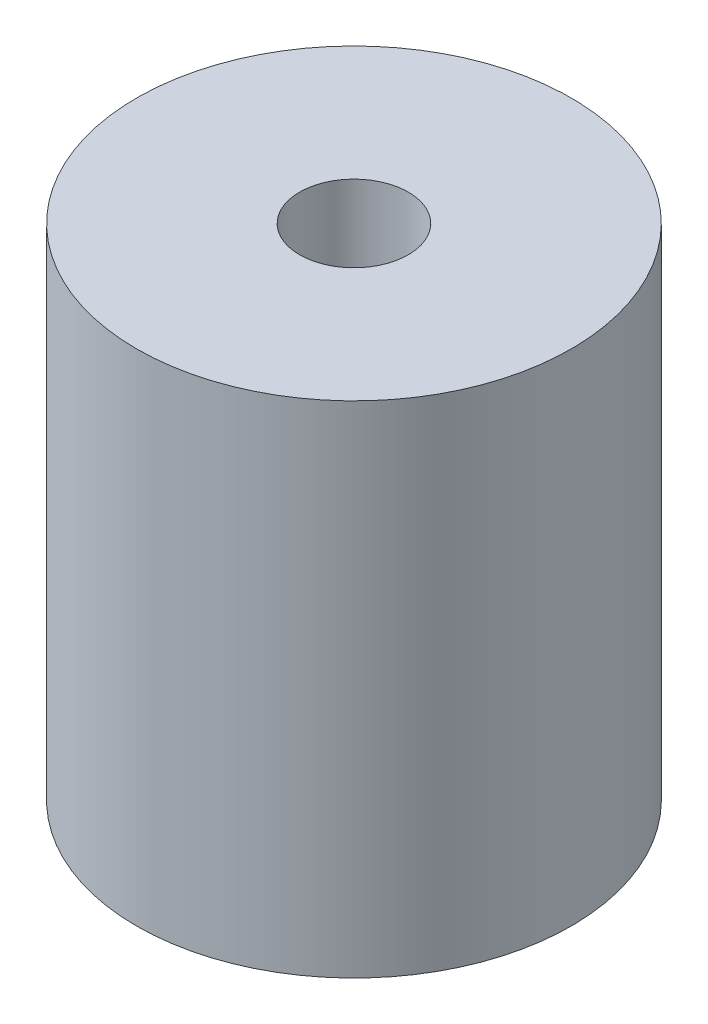
ISO-10303-21;
HEADER;
FILE_DESCRIPTION(('STEP AP214'),'2;1');
FILE_NAME('part.step','',(''),(''),'','','');
FILE_SCHEMA(('AUTOMOTIVE_DESIGN { 1 0 10303 214 1 1 1 1 }'));
ENDSEC;
DATA;
#1=APPLICATION_CONTEXT('core data for automotive mechanical design processes');
#2=APPLICATION_PROTOCOL_DEFINITION('international standard','automotive_design',2000,#1);
#3=PRODUCT_CONTEXT('',#1,'mechanical');
#4=PRODUCT('Part','Part','',(#3));
#5=PRODUCT_RELATED_PRODUCT_CATEGORY('part','',(#4));
#6=PRODUCT_DEFINITION_FORMATION('','',#4);
#7=PRODUCT_DEFINITION_CONTEXT('part definition',#1,'design');
#8=PRODUCT_DEFINITION('design','',#6,#7);
#9=PRODUCT_DEFINITION_SHAPE('','',#8);
#10=(LENGTH_UNIT() NAMED_UNIT(*) SI_UNIT(.MILLI.,.METRE.));
#11=(NAMED_UNIT(*) PLANE_ANGLE_UNIT() SI_UNIT($,.RADIAN.));
#12=(NAMED_UNIT(*) SI_UNIT($,.STERADIAN.) SOLID_ANGLE_UNIT());
#13=UNCERTAINTY_MEASURE_WITH_UNIT(LENGTH_MEASURE(1.E-05),#10,'distance_accuracy_value','');
#14=(GEOMETRIC_REPRESENTATION_CONTEXT(3) GLOBAL_UNCERTAINTY_ASSIGNED_CONTEXT((#13)) GLOBAL_UNIT_ASSIGNED_CONTEXT((#10,
#11,#12)) REPRESENTATION_CONTEXT('',''));
#15=CARTESIAN_POINT('',(0.,0.,0.));
#16=DIRECTION('',(0.,0.,1.));
#17=DIRECTION('',(1.,0.,0.));
#18=AXIS2_PLACEMENT_3D('',#15,#16,#17);
#19=CARTESIAN_POINT('',(0.,23.,0.));
#20=DIRECTION('',(0.,1.,0.));
#21=DIRECTION('',(0.,0.,1.));
#22=AXIS2_PLACEMENT_3D('',#19,#20,#21);
#23=PLANE('',#22);
#24=CARTESIAN_POINT('',(0.,23.,0.));
#25=DIRECTION('',(0.,1.,0.));
#26=DIRECTION('',(0.,0.,1.));
#27=AXIS2_PLACEMENT_3D('',#24,#25,#26);
#28=CIRCLE('',#27,10.);
#29=CARTESIAN_POINT('',(0.,23.,10.));
#30=VERTEX_POINT('',#29);
#31=EDGE_CURVE('E10',#30,#30,#28,.T.);
#32=ORIENTED_EDGE('',*,*,#31,.T.);
#33=EDGE_LOOP('',(#32));
#34=FACE_BOUND('',#33,.T.);
#35=CARTESIAN_POINT('',(0.,23.,0.));
#36=DIRECTION('',(0.,1.,0.));
#37=DIRECTION('',(0.,0.,1.));
#38=AXIS2_PLACEMENT_3D('',#35,#36,#37);
#39=CIRCLE('',#38,2.5);
#40=CARTESIAN_POINT('',(0.,23.,2.5));
#41=VERTEX_POINT('',#40);
#42=EDGE_CURVE('E46',#41,#41,#39,.T.);
#43=ORIENTED_EDGE('',*,*,#42,.F.);
#44=EDGE_LOOP('',(#43));
#45=FACE_BOUND('',#44,.T.);
#46=ADVANCED_FACE('F35',(#34,#45),#23,.T.);
#47=CARTESIAN_POINT('',(0.,0.,0.));
#48=DIRECTION('',(0.,1.,0.));
#49=DIRECTION('',(0.,0.,1.));
#50=AXIS2_PLACEMENT_3D('',#47,#48,#49);
#51=PLANE('',#50);
#52=CARTESIAN_POINT('',(0.,0.,0.));
#53=DIRECTION('',(0.,1.,0.));
#54=DIRECTION('',(0.,0.,1.));
#55=AXIS2_PLACEMENT_3D('',#52,#53,#54);
#56=CIRCLE('',#55,10.);
#57=CARTESIAN_POINT('',(0.,0.,10.));
#58=VERTEX_POINT('',#57);
#59=EDGE_CURVE('E39',#58,#58,#56,.T.);
#60=ORIENTED_EDGE('',*,*,#59,.F.);
#61=EDGE_LOOP('',(#60));
#62=FACE_BOUND('',#61,.T.);
#63=CARTESIAN_POINT('',(0.,0.,0.));
#64=DIRECTION('',(0.,1.,0.));
#65=DIRECTION('',(0.,0.,1.));
#66=AXIS2_PLACEMENT_3D('',#63,#64,#65);
#67=CIRCLE('',#66,2.5);
#68=CARTESIAN_POINT('',(0.,0.,2.5));
#69=VERTEX_POINT('',#68);
#70=EDGE_CURVE('E48',#69,#69,#67,.T.);
#71=ORIENTED_EDGE('',*,*,#70,.T.);
#72=EDGE_LOOP('',(#71));
#73=FACE_BOUND('',#72,.T.);
#74=ADVANCED_FACE('F58',(#62,#73),#51,.F.);
#75=CARTESIAN_POINT('',(0.,23.,0.));
#76=DIRECTION('',(0.,-1.,0.));
#77=DIRECTION('',(0.,0.,-1.));
#78=AXIS2_PLACEMENT_3D('',#75,#76,#77);
#79=CYLINDRICAL_SURFACE('',#78,10.);
#80=ORIENTED_EDGE('',*,*,#31,.F.);
#81=EDGE_LOOP('',(#80));
#82=FACE_BOUND('',#81,.T.);
#83=ORIENTED_EDGE('',*,*,#59,.T.);
#84=EDGE_LOOP('',(#83));
#85=FACE_BOUND('',#84,.T.);
#86=ADVANCED_FACE('F37',(#82,#85),#79,.T.);
#87=CARTESIAN_POINT('',(0.,23.,0.));
#88=DIRECTION('',(0.,-1.,0.));
#89=DIRECTION('',(0.,0.,-1.));
#90=AXIS2_PLACEMENT_3D('',#87,#88,#89);
#91=CYLINDRICAL_SURFACE('',#90,2.5);
#92=ORIENTED_EDGE('',*,*,#42,.T.);
#93=EDGE_LOOP('',(#92));
#94=FACE_BOUND('',#93,.T.);
#95=ORIENTED_EDGE('',*,*,#70,.F.);
#96=EDGE_LOOP('',(#95));
#97=FACE_BOUND('',#96,.T.);
#98=ADVANCED_FACE('F54',(#94,#97),#91,.F.);
#99=CLOSED_SHELL('',(#46,#74,#86,#98));
#100=MANIFOLD_SOLID_BREP('B2',#99);
#101=ADVANCED_BREP_SHAPE_REPRESENTATION('',(#18,#100),#14);
#102=SHAPE_DEFINITION_REPRESENTATION(#9,#101);
ENDSEC;
END-ISO-10303-21;
